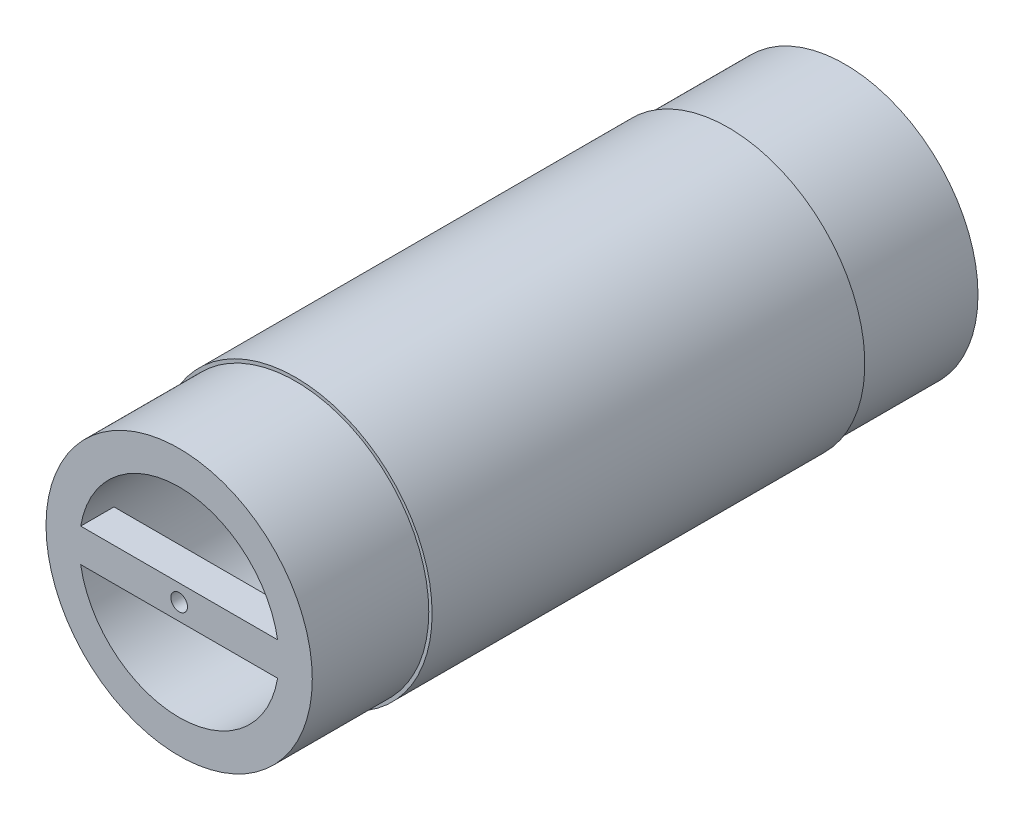
ISO-10303-21;
HEADER;
FILE_DESCRIPTION(('STEP AP214'),'2;1');
FILE_NAME('part.step','',(''),(''),'','','');
FILE_SCHEMA(('AUTOMOTIVE_DESIGN { 1 0 10303 214 1 1 1 1 }'));
ENDSEC;
DATA;
#1=APPLICATION_CONTEXT('core data for automotive mechanical design processes');
#2=APPLICATION_PROTOCOL_DEFINITION('international standard','automotive_design',2000,#1);
#3=PRODUCT_CONTEXT('',#1,'mechanical');
#4=PRODUCT('Part','Part','',(#3));
#5=PRODUCT_RELATED_PRODUCT_CATEGORY('part','',(#4));
#6=PRODUCT_DEFINITION_FORMATION('','',#4);
#7=PRODUCT_DEFINITION_CONTEXT('part definition',#1,'design');
#8=PRODUCT_DEFINITION('design','',#6,#7);
#9=PRODUCT_DEFINITION_SHAPE('','',#8);
#10=(LENGTH_UNIT() NAMED_UNIT(*) SI_UNIT(.MILLI.,.METRE.));
#11=(NAMED_UNIT(*) PLANE_ANGLE_UNIT() SI_UNIT($,.RADIAN.));
#12=(NAMED_UNIT(*) SI_UNIT($,.STERADIAN.) SOLID_ANGLE_UNIT());
#13=UNCERTAINTY_MEASURE_WITH_UNIT(LENGTH_MEASURE(1.E-05),#10,'distance_accuracy_value','');
#14=(GEOMETRIC_REPRESENTATION_CONTEXT(3) GLOBAL_UNCERTAINTY_ASSIGNED_CONTEXT((#13)) GLOBAL_UNIT_ASSIGNED_CONTEXT((#10,
#11,#12)) REPRESENTATION_CONTEXT('',''));
#15=CARTESIAN_POINT('',(0.,0.,0.));
#16=DIRECTION('',(0.,0.,1.));
#17=DIRECTION('',(1.,0.,0.));
#18=AXIS2_PLACEMENT_3D('',#15,#16,#17);
#19=CARTESIAN_POINT('',(0.,0.,110.));
#20=DIRECTION('',(0.,0.,-1.));
#21=DIRECTION('',(-1.,0.,0.));
#22=AXIS2_PLACEMENT_3D('',#19,#20,#21);
#23=CYLINDRICAL_SURFACE('',#22,44.);
#24=CARTESIAN_POINT('',(0.,0.,-71.5));
#25=DIRECTION('',(0.,0.,-1.));
#26=DIRECTION('',(-1.,0.,0.));
#27=AXIS2_PLACEMENT_3D('',#24,#25,#26);
#28=CIRCLE('',#27,44.);
#29=CARTESIAN_POINT('',(-44.,0.,-71.5));
#30=VERTEX_POINT('',#29);
#31=EDGE_CURVE('E194',#30,#30,#28,.T.);
#32=ORIENTED_EDGE('',*,*,#31,.T.);
#33=EDGE_LOOP('',(#32));
#34=FACE_BOUND('',#33,.T.);
#35=CARTESIAN_POINT('',(0.,0.,-110.));
#36=DIRECTION('',(0.,0.,1.));
#37=DIRECTION('',(1.,0.,0.));
#38=AXIS2_PLACEMENT_3D('',#35,#36,#37);
#39=CIRCLE('',#38,44.);
#40=CARTESIAN_POINT('',(44.,0.,-110.));
#41=VERTEX_POINT('',#40);
#42=EDGE_CURVE('E48',#41,#41,#39,.T.);
#43=ORIENTED_EDGE('',*,*,#42,.T.);
#44=EDGE_LOOP('',(#43));
#45=FACE_BOUND('',#44,.T.);
#46=ADVANCED_FACE('F39',(#34,#45),#23,.T.);
#47=CARTESIAN_POINT('',(32.5384388070479,5.5,110.));
#48=DIRECTION('',(0.,1.,0.));
#49=DIRECTION('',(-1.,0.,0.));
#50=AXIS2_PLACEMENT_3D('',#47,#48,#49);
#51=PLANE('',#50);
#52=DIRECTION('',(0.,0.,-1.));
#53=VECTOR('',#52,1.);
#54=CARTESIAN_POINT('',(-32.5384388070479,5.49999999999999,110.));
#55=LINE('',#54,#53);
#56=CARTESIAN_POINT('',(-32.5384388070479,5.49999999999999,-99.));
#57=VERTEX_POINT('',#56);
#58=CARTESIAN_POINT('',(-32.5384388070479,5.49999999999999,-110.));
#59=VERTEX_POINT('',#58);
#60=EDGE_CURVE('E153',#57,#59,#55,.T.);
#61=ORIENTED_EDGE('',*,*,#60,.F.);
#62=DIRECTION('',(1.,0.,0.));
#63=VECTOR('',#62,1.);
#64=CARTESIAN_POINT('',(-32.5384388070479,5.49999999999999,-99.));
#65=LINE('',#64,#63);
#66=CARTESIAN_POINT('',(32.5384388070479,5.5,-99.));
#67=VERTEX_POINT('',#66);
#68=EDGE_CURVE('E179',#57,#67,#65,.T.);
#69=ORIENTED_EDGE('',*,*,#68,.T.);
#70=DIRECTION('',(0.,0.,-1.));
#71=VECTOR('',#70,1.);
#72=CARTESIAN_POINT('',(32.5384388070479,5.5,110.));
#73=LINE('',#72,#71);
#74=CARTESIAN_POINT('',(32.5384388070479,5.5,-110.));
#75=VERTEX_POINT('',#74);
#76=EDGE_CURVE('E145',#67,#75,#73,.T.);
#77=ORIENTED_EDGE('',*,*,#76,.T.);
#78=DIRECTION('',(1.,0.,0.));
#79=VECTOR('',#78,1.);
#80=CARTESIAN_POINT('',(32.5384388070479,5.5,-110.));
#81=LINE('',#80,#79);
#82=EDGE_CURVE('E143',#59,#75,#81,.T.);
#83=ORIENTED_EDGE('',*,*,#82,.F.);
#84=EDGE_LOOP('',(#61,#69,#77,#83));
#85=FACE_BOUND('',#84,.T.);
#86=ADVANCED_FACE('F235',(#85),#51,.T.);
#87=CARTESIAN_POINT('',(32.5384388070479,-5.5,110.));
#88=DIRECTION('',(0.,-1.,0.));
#89=DIRECTION('',(1.,0.,0.));
#90=AXIS2_PLACEMENT_3D('',#87,#88,#89);
#91=PLANE('',#90);
#92=DIRECTION('',(0.,0.,-1.));
#93=VECTOR('',#92,1.);
#94=CARTESIAN_POINT('',(32.5384388070479,-5.5,110.));
#95=LINE('',#94,#93);
#96=CARTESIAN_POINT('',(32.5384388070479,-5.49999999999999,-99.));
#97=VERTEX_POINT('',#96);
#98=CARTESIAN_POINT('',(32.5384388070479,-5.5,-110.));
#99=VERTEX_POINT('',#98);
#100=EDGE_CURVE('E130',#97,#99,#95,.T.);
#101=ORIENTED_EDGE('',*,*,#100,.F.);
#102=DIRECTION('',(-1.,0.,0.));
#103=VECTOR('',#102,1.);
#104=CARTESIAN_POINT('',(32.5384388070479,-5.5,-99.));
#105=LINE('',#104,#103);
#106=CARTESIAN_POINT('',(-32.5384388070479,-5.5,-99.));
#107=VERTEX_POINT('',#106);
#108=EDGE_CURVE('E169',#97,#107,#105,.T.);
#109=ORIENTED_EDGE('',*,*,#108,.T.);
#110=DIRECTION('',(0.,0.,-1.));
#111=VECTOR('',#110,1.);
#112=CARTESIAN_POINT('',(-32.5384388070479,-5.5,110.));
#113=LINE('',#112,#111);
#114=CARTESIAN_POINT('',(-32.5384388070479,-5.5,-110.));
#115=VERTEX_POINT('',#114);
#116=EDGE_CURVE('E131',#107,#115,#113,.T.);
#117=ORIENTED_EDGE('',*,*,#116,.T.);
#118=DIRECTION('',(-1.,0.,0.));
#119=VECTOR('',#118,1.);
#120=CARTESIAN_POINT('',(32.5384388070479,-5.5,-110.));
#121=LINE('',#120,#119);
#122=EDGE_CURVE('E136',#99,#115,#121,.T.);
#123=ORIENTED_EDGE('',*,*,#122,.F.);
#124=EDGE_LOOP('',(#101,#109,#117,#123));
#125=FACE_BOUND('',#124,.T.);
#126=ADVANCED_FACE('F224',(#125),#91,.T.);
#127=CARTESIAN_POINT('',(0.,0.,110.));
#128=DIRECTION('',(0.,0.,1.));
#129=DIRECTION('',(1.,0.,0.));
#130=AXIS2_PLACEMENT_3D('',#127,#128,#129);
#131=PLANE('',#130);
#132=CARTESIAN_POINT('',(0.,0.,110.));
#133=DIRECTION('',(0.,0.,1.));
#134=DIRECTION('',(1.,0.,0.));
#135=AXIS2_PLACEMENT_3D('',#132,#133,#134);
#136=CIRCLE('',#135,2.75);
#137=CARTESIAN_POINT('',(2.75,0.,110.));
#138=VERTEX_POINT('',#137);
#139=EDGE_CURVE('E125',#138,#138,#136,.T.);
#140=ORIENTED_EDGE('',*,*,#139,.F.);
#141=EDGE_LOOP('',(#140));
#142=FACE_BOUND('',#141,.T.);
#143=CARTESIAN_POINT('',(0.,0.,110.));
#144=DIRECTION('',(0.,0.,1.));
#145=DIRECTION('',(1.,0.,0.));
#146=AXIS2_PLACEMENT_3D('',#143,#144,#145);
#147=CIRCLE('',#146,44.);
#148=CARTESIAN_POINT('',(44.,0.,110.));
#149=VERTEX_POINT('',#148);
#150=EDGE_CURVE('E12',#149,#149,#147,.T.);
#151=ORIENTED_EDGE('',*,*,#150,.T.);
#152=EDGE_LOOP('',(#151));
#153=FACE_BOUND('',#152,.T.);
#154=DIRECTION('',(1.,0.,0.));
#155=VECTOR('',#154,1.);
#156=CARTESIAN_POINT('',(32.5384388070479,5.5,110.));
#157=LINE('',#156,#155);
#158=CARTESIAN_POINT('',(-32.5384388070479,5.49999999999999,110.));
#159=VERTEX_POINT('',#158);
#160=CARTESIAN_POINT('',(32.5384388070479,5.5,110.));
#161=VERTEX_POINT('',#160);
#162=EDGE_CURVE('E142',#159,#161,#157,.T.);
#163=ORIENTED_EDGE('',*,*,#162,.F.);
#164=CARTESIAN_POINT('',(0.,0.,110.));
#165=DIRECTION('',(0.,0.,1.));
#166=DIRECTION('',(1.,0.,0.));
#167=AXIS2_PLACEMENT_3D('',#164,#165,#166);
#168=CIRCLE('',#167,33.);
#169=EDGE_CURVE('E140',#161,#159,#168,.T.);
#170=ORIENTED_EDGE('',*,*,#169,.F.);
#171=EDGE_LOOP('',(#163,#170));
#172=FACE_BOUND('',#171,.T.);
#173=DIRECTION('',(-1.,0.,0.));
#174=VECTOR('',#173,1.);
#175=CARTESIAN_POINT('',(32.5384388070479,-5.5,110.));
#176=LINE('',#175,#174);
#177=CARTESIAN_POINT('',(32.5384388070479,-5.5,110.));
#178=VERTEX_POINT('',#177);
#179=CARTESIAN_POINT('',(-32.5384388070479,-5.5,110.));
#180=VERTEX_POINT('',#179);
#181=EDGE_CURVE('E129',#178,#180,#176,.T.);
#182=ORIENTED_EDGE('',*,*,#181,.F.);
#183=CARTESIAN_POINT('',(0.,0.,110.));
#184=DIRECTION('',(0.,0.,1.));
#185=DIRECTION('',(1.,0.,0.));
#186=AXIS2_PLACEMENT_3D('',#183,#184,#185);
#187=CIRCLE('',#186,33.);
#188=EDGE_CURVE('E170',#180,#178,#187,.T.);
#189=ORIENTED_EDGE('',*,*,#188,.F.);
#190=EDGE_LOOP('',(#182,#189));
#191=FACE_BOUND('',#190,.T.);
#192=ADVANCED_FACE('F161',(#142,#153,#172,#191),#131,.T.);
#193=CARTESIAN_POINT('',(0.,0.,-110.));
#194=DIRECTION('',(0.,0.,1.));
#195=DIRECTION('',(1.,0.,0.));
#196=AXIS2_PLACEMENT_3D('',#193,#194,#195);
#197=PLANE('',#196);
#198=CARTESIAN_POINT('',(0.,0.,-110.));
#199=DIRECTION('',(0.,0.,1.));
#200=DIRECTION('',(1.,0.,0.));
#201=AXIS2_PLACEMENT_3D('',#198,#199,#200);
#202=CIRCLE('',#201,2.75);
#203=CARTESIAN_POINT('',(2.75,0.,-110.));
#204=VERTEX_POINT('',#203);
#205=EDGE_CURVE('E187',#204,#204,#202,.T.);
#206=ORIENTED_EDGE('',*,*,#205,.T.);
#207=EDGE_LOOP('',(#206));
#208=FACE_BOUND('',#207,.T.);
#209=CARTESIAN_POINT('',(0.,0.,-110.));
#210=DIRECTION('',(0.,0.,1.));
#211=DIRECTION('',(1.,0.,0.));
#212=AXIS2_PLACEMENT_3D('',#209,#210,#211);
#213=CIRCLE('',#212,33.);
#214=EDGE_CURVE('E139',#75,#59,#213,.T.);
#215=ORIENTED_EDGE('',*,*,#214,.T.);
#216=ORIENTED_EDGE('',*,*,#82,.T.);
#217=EDGE_LOOP('',(#215,#216));
#218=FACE_BOUND('',#217,.T.);
#219=ORIENTED_EDGE('',*,*,#42,.F.);
#220=EDGE_LOOP('',(#219));
#221=FACE_BOUND('',#220,.T.);
#222=CARTESIAN_POINT('',(0.,0.,-110.));
#223=DIRECTION('',(0.,0.,1.));
#224=DIRECTION('',(1.,0.,0.));
#225=AXIS2_PLACEMENT_3D('',#222,#223,#224);
#226=CIRCLE('',#225,33.);
#227=EDGE_CURVE('E166',#115,#99,#226,.T.);
#228=ORIENTED_EDGE('',*,*,#227,.T.);
#229=ORIENTED_EDGE('',*,*,#122,.T.);
#230=EDGE_LOOP('',(#228,#229));
#231=FACE_BOUND('',#230,.T.);
#232=ADVANCED_FACE('F158',(#208,#218,#221,#231),#197,.F.);
#233=CARTESIAN_POINT('',(0.,0.,71.5));
#234=DIRECTION('',(0.,0.,1.));
#235=DIRECTION('',(1.,0.,0.));
#236=AXIS2_PLACEMENT_3D('',#233,#234,#235);
#237=CIRCLE('',#236,44.);
#238=CARTESIAN_POINT('',(44.,0.,71.5));
#239=VERTEX_POINT('',#238);
#240=EDGE_CURVE('E190',#239,#239,#237,.F.);
#241=ORIENTED_EDGE('',*,*,#240,.F.);
#242=EDGE_LOOP('',(#241));
#243=FACE_BOUND('',#242,.T.);
#244=ORIENTED_EDGE('',*,*,#150,.F.);
#245=EDGE_LOOP('',(#244));
#246=FACE_BOUND('',#245,.T.);
#247=ADVANCED_FACE('F41',(#243,#246),#23,.T.);
#248=CARTESIAN_POINT('',(0.,0.,110.));
#249=DIRECTION('',(0.,0.,-1.));
#250=DIRECTION('',(-1.,0.,0.));
#251=AXIS2_PLACEMENT_3D('',#248,#249,#250);
#252=CYLINDRICAL_SURFACE('',#251,33.);
#253=CARTESIAN_POINT('',(-32.5384388070479,5.49999999999999,99.));
#254=VERTEX_POINT('',#253);
#255=EDGE_CURVE('E124',#159,#254,#55,.T.);
#256=ORIENTED_EDGE('',*,*,#255,.T.);
#257=CARTESIAN_POINT('',(0.,0.,99.));
#258=DIRECTION('',(0.,0.,1.));
#259=DIRECTION('',(1.,0.,0.));
#260=AXIS2_PLACEMENT_3D('',#257,#258,#259);
#261=CIRCLE('',#260,33.);
#262=CARTESIAN_POINT('',(-32.5384388070479,-5.5,99.));
#263=VERTEX_POINT('',#262);
#264=EDGE_CURVE('E108',#254,#263,#261,.T.);
#265=ORIENTED_EDGE('',*,*,#264,.T.);
#266=EDGE_CURVE('E121',#180,#263,#113,.T.);
#267=ORIENTED_EDGE('',*,*,#266,.F.);
#268=ORIENTED_EDGE('',*,*,#188,.T.);
#269=CARTESIAN_POINT('',(32.5384388070479,-5.49999999999999,99.));
#270=VERTEX_POINT('',#269);
#271=EDGE_CURVE('E133',#178,#270,#95,.T.);
#272=ORIENTED_EDGE('',*,*,#271,.T.);
#273=CARTESIAN_POINT('',(0.,0.,99.));
#274=DIRECTION('',(0.,0.,1.));
#275=DIRECTION('',(1.,0.,0.));
#276=AXIS2_PLACEMENT_3D('',#273,#274,#275);
#277=CIRCLE('',#276,33.);
#278=CARTESIAN_POINT('',(32.5384388070479,5.5,99.));
#279=VERTEX_POINT('',#278);
#280=EDGE_CURVE('E110',#270,#279,#277,.T.);
#281=ORIENTED_EDGE('',*,*,#280,.T.);
#282=EDGE_CURVE('E150',#161,#279,#73,.T.);
#283=ORIENTED_EDGE('',*,*,#282,.F.);
#284=ORIENTED_EDGE('',*,*,#169,.T.);
#285=EDGE_LOOP('',(#256,#265,#267,#268,#272,#281,#283,#284));
#286=FACE_BOUND('',#285,.T.);
#287=ORIENTED_EDGE('',*,*,#214,.F.);
#288=ORIENTED_EDGE('',*,*,#76,.F.);
#289=CARTESIAN_POINT('',(0.,0.,-99.));
#290=DIRECTION('',(0.,0.,1.));
#291=DIRECTION('',(1.,0.,0.));
#292=AXIS2_PLACEMENT_3D('',#289,#290,#291);
#293=CIRCLE('',#292,33.);
#294=EDGE_CURVE('E56',#67,#97,#293,.F.);
#295=ORIENTED_EDGE('',*,*,#294,.T.);
#296=ORIENTED_EDGE('',*,*,#100,.T.);
#297=ORIENTED_EDGE('',*,*,#227,.F.);
#298=ORIENTED_EDGE('',*,*,#116,.F.);
#299=CARTESIAN_POINT('',(0.,0.,-99.));
#300=DIRECTION('',(0.,0.,1.));
#301=DIRECTION('',(1.,0.,0.));
#302=AXIS2_PLACEMENT_3D('',#299,#300,#301);
#303=CIRCLE('',#302,33.);
#304=EDGE_CURVE('E61',#107,#57,#303,.F.);
#305=ORIENTED_EDGE('',*,*,#304,.T.);
#306=ORIENTED_EDGE('',*,*,#60,.T.);
#307=EDGE_LOOP('',(#287,#288,#295,#296,#297,#298,#305,#306));
#308=FACE_BOUND('',#307,.T.);
#309=ADVANCED_FACE('F118',(#286,#308),#252,.F.);
#310=DIRECTION('',(-1.,0.,0.));
#311=VECTOR('',#310,1.);
#312=CARTESIAN_POINT('',(-32.5384388070479,5.49999999999999,99.));
#313=LINE('',#312,#311);
#314=EDGE_CURVE('E175',#279,#254,#313,.T.);
#315=ORIENTED_EDGE('',*,*,#314,.T.);
#316=ORIENTED_EDGE('',*,*,#255,.F.);
#317=ORIENTED_EDGE('',*,*,#162,.T.);
#318=ORIENTED_EDGE('',*,*,#282,.T.);
#319=EDGE_LOOP('',(#315,#316,#317,#318));
#320=FACE_BOUND('',#319,.T.);
#321=ADVANCED_FACE('F232',(#320),#51,.T.);
#322=DIRECTION('',(1.,0.,0.));
#323=VECTOR('',#322,1.);
#324=CARTESIAN_POINT('',(32.5384388070479,-5.5,99.));
#325=LINE('',#324,#323);
#326=EDGE_CURVE('E104',#263,#270,#325,.T.);
#327=ORIENTED_EDGE('',*,*,#326,.T.);
#328=ORIENTED_EDGE('',*,*,#271,.F.);
#329=ORIENTED_EDGE('',*,*,#181,.T.);
#330=ORIENTED_EDGE('',*,*,#266,.T.);
#331=EDGE_LOOP('',(#327,#328,#329,#330));
#332=FACE_BOUND('',#331,.T.);
#333=ADVANCED_FACE('F127',(#332),#91,.T.);
#334=CARTESIAN_POINT('',(0.,0.,99.));
#335=DIRECTION('',(0.,0.,1.));
#336=DIRECTION('',(1.,0.,0.));
#337=AXIS2_PLACEMENT_3D('',#334,#335,#336);
#338=PLANE('',#337);
#339=CARTESIAN_POINT('',(0.,0.,99.));
#340=DIRECTION('',(0.,0.,1.));
#341=DIRECTION('',(1.,0.,0.));
#342=AXIS2_PLACEMENT_3D('',#339,#340,#341);
#343=CIRCLE('',#342,2.75);
#344=CARTESIAN_POINT('',(2.75,0.,99.));
#345=VERTEX_POINT('',#344);
#346=EDGE_CURVE('E184',#345,#345,#343,.T.);
#347=ORIENTED_EDGE('',*,*,#346,.T.);
#348=EDGE_LOOP('',(#347));
#349=FACE_BOUND('',#348,.T.);
#350=ORIENTED_EDGE('',*,*,#264,.F.);
#351=ORIENTED_EDGE('',*,*,#314,.F.);
#352=ORIENTED_EDGE('',*,*,#280,.F.);
#353=ORIENTED_EDGE('',*,*,#326,.F.);
#354=EDGE_LOOP('',(#350,#351,#352,#353));
#355=FACE_BOUND('',#354,.T.);
#356=ADVANCED_FACE('F106',(#349,#355),#338,.F.);
#357=CARTESIAN_POINT('',(0.,0.,-99.));
#358=DIRECTION('',(0.,0.,1.));
#359=DIRECTION('',(1.,0.,0.));
#360=AXIS2_PLACEMENT_3D('',#357,#358,#359);
#361=PLANE('',#360);
#362=CARTESIAN_POINT('',(0.,0.,-99.));
#363=DIRECTION('',(0.,0.,1.));
#364=DIRECTION('',(1.,0.,0.));
#365=AXIS2_PLACEMENT_3D('',#362,#363,#364);
#366=CIRCLE('',#365,2.75);
#367=CARTESIAN_POINT('',(2.75,0.,-99.));
#368=VERTEX_POINT('',#367);
#369=EDGE_CURVE('E43',#368,#368,#366,.T.);
#370=ORIENTED_EDGE('',*,*,#369,.F.);
#371=EDGE_LOOP('',(#370));
#372=FACE_BOUND('',#371,.T.);
#373=ORIENTED_EDGE('',*,*,#304,.F.);
#374=ORIENTED_EDGE('',*,*,#108,.F.);
#375=ORIENTED_EDGE('',*,*,#294,.F.);
#376=ORIENTED_EDGE('',*,*,#68,.F.);
#377=EDGE_LOOP('',(#373,#374,#375,#376));
#378=FACE_BOUND('',#377,.T.);
#379=ADVANCED_FACE('F258',(#372,#378),#361,.T.);
#380=CARTESIAN_POINT('',(0.,0.,-110.));
#381=DIRECTION('',(0.,0.,1.));
#382=DIRECTION('',(1.,0.,0.));
#383=AXIS2_PLACEMENT_3D('',#380,#381,#382);
#384=CYLINDRICAL_SURFACE('',#383,2.75);
#385=ORIENTED_EDGE('',*,*,#369,.T.);
#386=EDGE_LOOP('',(#385));
#387=FACE_BOUND('',#386,.T.);
#388=ORIENTED_EDGE('',*,*,#205,.F.);
#389=EDGE_LOOP('',(#388));
#390=FACE_BOUND('',#389,.T.);
#391=ADVANCED_FACE('F255',(#387,#390),#384,.F.);
#392=ORIENTED_EDGE('',*,*,#139,.T.);
#393=EDGE_LOOP('',(#392));
#394=FACE_BOUND('',#393,.T.);
#395=ORIENTED_EDGE('',*,*,#346,.F.);
#396=EDGE_LOOP('',(#395));
#397=FACE_BOUND('',#396,.T.);
#398=ADVANCED_FACE('F208',(#394,#397),#384,.F.);
#399=CARTESIAN_POINT('',(0.,0.,237.562063326053));
#400=DIRECTION('',(0.,0.,-1.));
#401=DIRECTION('',(-1.,0.,0.));
#402=AXIS2_PLACEMENT_3D('',#399,#400,#401);
#403=CYLINDRICAL_SURFACE('',#402,45.1);
#404=CARTESIAN_POINT('',(0.,0.,-71.5));
#405=DIRECTION('',(0.,0.,-1.));
#406=DIRECTION('',(-1.,0.,0.));
#407=AXIS2_PLACEMENT_3D('',#404,#405,#406);
#408=CIRCLE('',#407,45.1);
#409=CARTESIAN_POINT('',(-45.1,0.,-71.5));
#410=VERTEX_POINT('',#409);
#411=EDGE_CURVE('E197',#410,#410,#408,.T.);
#412=ORIENTED_EDGE('',*,*,#411,.F.);
#413=EDGE_LOOP('',(#412));
#414=FACE_BOUND('',#413,.T.);
#415=CARTESIAN_POINT('',(0.,0.,71.5));
#416=DIRECTION('',(0.,0.,1.));
#417=DIRECTION('',(1.,0.,0.));
#418=AXIS2_PLACEMENT_3D('',#415,#416,#417);
#419=CIRCLE('',#418,45.1);
#420=CARTESIAN_POINT('',(45.1,0.,71.5));
#421=VERTEX_POINT('',#420);
#422=EDGE_CURVE('E191',#421,#421,#419,.F.);
#423=ORIENTED_EDGE('',*,*,#422,.T.);
#424=EDGE_LOOP('',(#423));
#425=FACE_BOUND('',#424,.T.);
#426=ADVANCED_FACE('F205',(#414,#425),#403,.T.);
#427=CARTESIAN_POINT('',(0.,0.,-71.5));
#428=DIRECTION('',(0.,0.,-1.));
#429=DIRECTION('',(-1.,0.,0.));
#430=AXIS2_PLACEMENT_3D('',#427,#428,#429);
#431=PLANE('',#430);
#432=ORIENTED_EDGE('',*,*,#31,.F.);
#433=EDGE_LOOP('',(#432));
#434=FACE_BOUND('',#433,.T.);
#435=ORIENTED_EDGE('',*,*,#411,.T.);
#436=EDGE_LOOP('',(#435));
#437=FACE_BOUND('',#436,.T.);
#438=ADVANCED_FACE('F203',(#434,#437),#431,.T.);
#439=CARTESIAN_POINT('',(0.,0.,71.5));
#440=DIRECTION('',(0.,0.,1.));
#441=DIRECTION('',(1.,0.,0.));
#442=AXIS2_PLACEMENT_3D('',#439,#440,#441);
#443=PLANE('',#442);
#444=ORIENTED_EDGE('',*,*,#422,.F.);
#445=EDGE_LOOP('',(#444));
#446=FACE_BOUND('',#445,.T.);
#447=ORIENTED_EDGE('',*,*,#240,.T.);
#448=EDGE_LOOP('',(#447));
#449=FACE_BOUND('',#448,.T.);
#450=ADVANCED_FACE('F212',(#446,#449),#443,.T.);
#451=CLOSED_SHELL('',(#46,#86,#126,#192,#232,#247,#309,#321,#333,#356,#379,#391,#398,#426,#438,#450));
#452=MANIFOLD_SOLID_BREP('B2',#451);
#453=ADVANCED_BREP_SHAPE_REPRESENTATION('',(#18,#452),#14);
#454=SHAPE_DEFINITION_REPRESENTATION(#9,#453);
ENDSEC;
END-ISO-10303-21;
